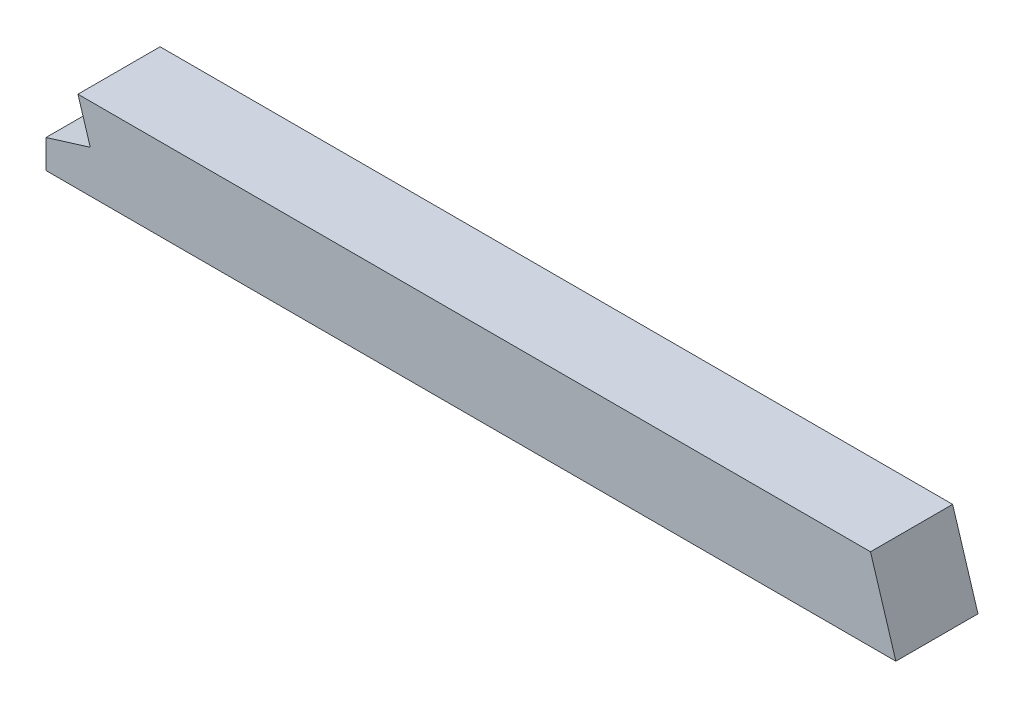
ISO-10303-21;
HEADER;
FILE_DESCRIPTION(('STEP AP214'),'2;1');
FILE_NAME('part.step','',(''),(''),'','','');
FILE_SCHEMA(('AUTOMOTIVE_DESIGN { 1 0 10303 214 1 1 1 1 }'));
ENDSEC;
DATA;
#1=APPLICATION_CONTEXT('core data for automotive mechanical design processes');
#2=APPLICATION_PROTOCOL_DEFINITION('international standard','automotive_design',2000,#1);
#3=PRODUCT_CONTEXT('',#1,'mechanical');
#4=PRODUCT('Part','Part','',(#3));
#5=PRODUCT_RELATED_PRODUCT_CATEGORY('part','',(#4));
#6=PRODUCT_DEFINITION_FORMATION('','',#4);
#7=PRODUCT_DEFINITION_CONTEXT('part definition',#1,'design');
#8=PRODUCT_DEFINITION('design','',#6,#7);
#9=PRODUCT_DEFINITION_SHAPE('','',#8);
#10=(LENGTH_UNIT() NAMED_UNIT(*) SI_UNIT(.MILLI.,.METRE.));
#11=(NAMED_UNIT(*) PLANE_ANGLE_UNIT() SI_UNIT($,.RADIAN.));
#12=(NAMED_UNIT(*) SI_UNIT($,.STERADIAN.) SOLID_ANGLE_UNIT());
#13=UNCERTAINTY_MEASURE_WITH_UNIT(LENGTH_MEASURE(1.E-05),#10,'distance_accuracy_value','');
#14=(GEOMETRIC_REPRESENTATION_CONTEXT(3) GLOBAL_UNCERTAINTY_ASSIGNED_CONTEXT((#13)) GLOBAL_UNIT_ASSIGNED_CONTEXT((#10,
#11,#12)) REPRESENTATION_CONTEXT('',''));
#15=CARTESIAN_POINT('',(0.,0.,0.));
#16=DIRECTION('',(0.,0.,1.));
#17=DIRECTION('',(1.,0.,0.));
#18=AXIS2_PLACEMENT_3D('',#15,#16,#17);
#19=CARTESIAN_POINT('',(394.2334,19.05,-19.05));
#20=DIRECTION('',(0.,0.,1.));
#21=DIRECTION('',(0.,-1.,0.));
#22=AXIS2_PLACEMENT_3D('',#19,#20,#21);
#23=PLANE('',#22);
#24=DIRECTION('',(0.,1.,0.));
#25=VECTOR('',#24,1.);
#26=CARTESIAN_POINT('',(0.,19.05,-19.05));
#27=LINE('',#26,#25);
#28=CARTESIAN_POINT('',(0.,-19.05,-19.05));
#29=VERTEX_POINT('',#28);
#30=CARTESIAN_POINT('',(0.,-5.7583149578052,-19.05));
#31=VERTEX_POINT('',#30);
#32=EDGE_CURVE('E122',#29,#31,#27,.T.);
#33=ORIENTED_EDGE('',*,*,#32,.T.);
#34=DIRECTION('',(0.955484572473958,0.295041067928275,0.));
#35=VECTOR('',#34,1.);
#36=CARTESIAN_POINT('',(1.62331038112594,-5.25705806447163,-19.05));
#37=LINE('',#36,#35);
#38=CARTESIAN_POINT('',(20.5222865781494,0.578697195797458,-19.05));
#39=VERTEX_POINT('',#38);
#40=EDGE_CURVE('E58',#31,#39,#37,.T.);
#41=ORIENTED_EDGE('',*,*,#40,.T.);
#42=DIRECTION('',(-0.295041067928275,0.955484572473958,0.));
#43=VECTOR('',#42,1.);
#44=CARTESIAN_POINT('',(18.8989761970235,5.83575526026909,-19.05));
#45=LINE('',#44,#43);
#46=CARTESIAN_POINT('',(14.8185912361433,19.05,-19.05));
#47=VERTEX_POINT('',#46);
#48=EDGE_CURVE('E109',#39,#47,#45,.T.);
#49=ORIENTED_EDGE('',*,*,#48,.T.);
#50=DIRECTION('',(-1.,0.,0.));
#51=VECTOR('',#50,1.);
#52=CARTESIAN_POINT('',(394.2334,19.05,-19.05));
#53=LINE('',#52,#51);
#54=CARTESIAN_POINT('',(382.468621151754,19.05,-19.05));
#55=VERTEX_POINT('',#54);
#56=EDGE_CURVE('E51',#55,#47,#53,.T.);
#57=ORIENTED_EDGE('',*,*,#56,.F.);
#58=DIRECTION('',(0.295041067928275,-0.955484572473958,0.));
#59=VECTOR('',#58,1.);
#60=CARTESIAN_POINT('',(394.2334,-19.05,-19.05));
#61=LINE('',#60,#59);
#62=CARTESIAN_POINT('',(394.2334,-19.05,-19.05));
#63=VERTEX_POINT('',#62);
#64=EDGE_CURVE('E135',#55,#63,#61,.T.);
#65=ORIENTED_EDGE('',*,*,#64,.T.);
#66=DIRECTION('',(-1.,0.,0.));
#67=VECTOR('',#66,1.);
#68=CARTESIAN_POINT('',(394.2334,-19.05,-19.05));
#69=LINE('',#68,#67);
#70=EDGE_CURVE('E145',#63,#29,#69,.T.);
#71=ORIENTED_EDGE('',*,*,#70,.T.);
#72=EDGE_LOOP('',(#33,#41,#49,#57,#65,#71));
#73=FACE_BOUND('',#72,.T.);
#74=ADVANCED_FACE('F43',(#73),#23,.F.);
#75=CARTESIAN_POINT('',(394.2334,19.05,19.05));
#76=DIRECTION('',(0.,-1.,0.));
#77=DIRECTION('',(0.,0.,-1.));
#78=AXIS2_PLACEMENT_3D('',#75,#76,#77);
#79=PLANE('',#78);
#80=ORIENTED_EDGE('',*,*,#56,.T.);
#81=DIRECTION('',(0.,0.,1.));
#82=VECTOR('',#81,1.);
#83=CARTESIAN_POINT('',(14.8185912361433,19.05,19.05));
#84=LINE('',#83,#82);
#85=CARTESIAN_POINT('',(14.8185912361433,19.05,19.05));
#86=VERTEX_POINT('',#85);
#87=EDGE_CURVE('E108',#47,#86,#84,.T.);
#88=ORIENTED_EDGE('',*,*,#87,.T.);
#89=DIRECTION('',(-1.,0.,0.));
#90=VECTOR('',#89,1.);
#91=CARTESIAN_POINT('',(394.2334,19.05,19.05));
#92=LINE('',#91,#90);
#93=CARTESIAN_POINT('',(382.468621151754,19.05,19.05));
#94=VERTEX_POINT('',#93);
#95=EDGE_CURVE('E158',#94,#86,#92,.T.);
#96=ORIENTED_EDGE('',*,*,#95,.F.);
#97=DIRECTION('',(0.,0.,1.));
#98=VECTOR('',#97,1.);
#99=CARTESIAN_POINT('',(382.468621151754,19.05,-19.05));
#100=LINE('',#99,#98);
#101=EDGE_CURVE('E138',#55,#94,#100,.T.);
#102=ORIENTED_EDGE('',*,*,#101,.F.);
#103=EDGE_LOOP('',(#80,#88,#96,#102));
#104=FACE_BOUND('',#103,.T.);
#105=ADVANCED_FACE('F166',(#104),#79,.F.);
#106=CARTESIAN_POINT('',(394.2334,19.05,19.05));
#107=DIRECTION('',(0.,0.,-1.));
#108=DIRECTION('',(0.,1.,0.));
#109=AXIS2_PLACEMENT_3D('',#106,#107,#108);
#110=PLANE('',#109);
#111=DIRECTION('',(-0.295041067928275,0.955484572473958,0.));
#112=VECTOR('',#111,1.);
#113=CARTESIAN_POINT('',(18.8989761970235,5.83575526026909,19.05));
#114=LINE('',#113,#112);
#115=CARTESIAN_POINT('',(20.5222865781494,0.578697195797458,19.05));
#116=VERTEX_POINT('',#115);
#117=EDGE_CURVE('E124',#116,#86,#114,.T.);
#118=ORIENTED_EDGE('',*,*,#117,.F.);
#119=DIRECTION('',(0.955484572473958,0.295041067928275,0.));
#120=VECTOR('',#119,1.);
#121=CARTESIAN_POINT('',(1.62331038112594,-5.25705806447163,19.05));
#122=LINE('',#121,#120);
#123=CARTESIAN_POINT('',(0.,-5.7583149578052,19.05));
#124=VERTEX_POINT('',#123);
#125=EDGE_CURVE('E104',#124,#116,#122,.T.);
#126=ORIENTED_EDGE('',*,*,#125,.F.);
#127=DIRECTION('',(0.,-1.,0.));
#128=VECTOR('',#127,1.);
#129=CARTESIAN_POINT('',(0.,19.05,19.05));
#130=LINE('',#129,#128);
#131=CARTESIAN_POINT('',(0.,-19.05,19.05));
#132=VERTEX_POINT('',#131);
#133=EDGE_CURVE('E79',#124,#132,#130,.T.);
#134=ORIENTED_EDGE('',*,*,#133,.T.);
#135=DIRECTION('',(-1.,0.,0.));
#136=VECTOR('',#135,1.);
#137=CARTESIAN_POINT('',(394.2334,-19.05,19.05));
#138=LINE('',#137,#136);
#139=CARTESIAN_POINT('',(394.2334,-19.05,19.05));
#140=VERTEX_POINT('',#139);
#141=EDGE_CURVE('E155',#140,#132,#138,.T.);
#142=ORIENTED_EDGE('',*,*,#141,.F.);
#143=DIRECTION('',(0.295041067928275,-0.955484572473958,0.));
#144=VECTOR('',#143,1.);
#145=CARTESIAN_POINT('',(394.2334,-19.05,19.05));
#146=LINE('',#145,#144);
#147=EDGE_CURVE('E66',#94,#140,#146,.T.);
#148=ORIENTED_EDGE('',*,*,#147,.F.);
#149=ORIENTED_EDGE('',*,*,#95,.T.);
#150=EDGE_LOOP('',(#118,#126,#134,#142,#148,#149));
#151=FACE_BOUND('',#150,.T.);
#152=ADVANCED_FACE('F174',(#151),#110,.F.);
#153=CARTESIAN_POINT('',(394.2334,-19.05,19.05));
#154=DIRECTION('',(0.,1.,0.));
#155=DIRECTION('',(0.,0.,1.));
#156=AXIS2_PLACEMENT_3D('',#153,#154,#155);
#157=PLANE('',#156);
#158=DIRECTION('',(0.,0.,-1.));
#159=VECTOR('',#158,1.);
#160=CARTESIAN_POINT('',(0.,-19.05,19.05));
#161=LINE('',#160,#159);
#162=EDGE_CURVE('E146',#132,#29,#161,.T.);
#163=ORIENTED_EDGE('',*,*,#162,.T.);
#164=ORIENTED_EDGE('',*,*,#70,.F.);
#165=DIRECTION('',(0.,0.,-1.));
#166=VECTOR('',#165,1.);
#167=CARTESIAN_POINT('',(394.2334,-19.05,19.05));
#168=LINE('',#167,#166);
#169=EDGE_CURVE('E84',#140,#63,#168,.T.);
#170=ORIENTED_EDGE('',*,*,#169,.F.);
#171=ORIENTED_EDGE('',*,*,#141,.T.);
#172=EDGE_LOOP('',(#163,#164,#170,#171));
#173=FACE_BOUND('',#172,.T.);
#174=ADVANCED_FACE('F170',(#173),#157,.F.);
#175=CARTESIAN_POINT('',(0.,0.,0.));
#176=DIRECTION('',(1.,0.,0.));
#177=DIRECTION('',(0.,0.,-1.));
#178=AXIS2_PLACEMENT_3D('',#175,#176,#177);
#179=PLANE('',#178);
#180=ORIENTED_EDGE('',*,*,#133,.F.);
#181=DIRECTION('',(0.,0.,-1.));
#182=VECTOR('',#181,1.);
#183=CARTESIAN_POINT('',(0.,-5.75831495780521,0.));
#184=LINE('',#183,#182);
#185=EDGE_CURVE('E11',#124,#31,#184,.T.);
#186=ORIENTED_EDGE('',*,*,#185,.T.);
#187=ORIENTED_EDGE('',*,*,#32,.F.);
#188=ORIENTED_EDGE('',*,*,#162,.F.);
#189=EDGE_LOOP('',(#180,#186,#187,#188));
#190=FACE_BOUND('',#189,.T.);
#191=ADVANCED_FACE('F173',(#190),#179,.F.);
#192=CARTESIAN_POINT('',(394.2334,-19.05,-19.05));
#193=DIRECTION('',(-0.955484572473958,-0.295041067928275,0.));
#194=DIRECTION('',(0.295041067928275,-0.955484572473958,0.));
#195=AXIS2_PLACEMENT_3D('',#192,#193,#194);
#196=PLANE('',#195);
#197=ORIENTED_EDGE('',*,*,#147,.T.);
#198=ORIENTED_EDGE('',*,*,#169,.T.);
#199=ORIENTED_EDGE('',*,*,#64,.F.);
#200=ORIENTED_EDGE('',*,*,#101,.T.);
#201=EDGE_LOOP('',(#197,#198,#199,#200));
#202=FACE_BOUND('',#201,.T.);
#203=ADVANCED_FACE('F175',(#202),#196,.F.);
#204=CARTESIAN_POINT('',(18.8989761970235,5.83575526026909,-19.05));
#205=DIRECTION('',(0.955484572473958,0.295041067928275,0.));
#206=DIRECTION('',(-0.295041067928275,0.955484572473958,0.));
#207=AXIS2_PLACEMENT_3D('',#204,#205,#206);
#208=PLANE('',#207);
#209=ORIENTED_EDGE('',*,*,#48,.F.);
#210=DIRECTION('',(0.,0.,1.));
#211=VECTOR('',#210,1.);
#212=CARTESIAN_POINT('',(20.5222865781494,0.578697195797458,-19.05));
#213=LINE('',#212,#211);
#214=EDGE_CURVE('E101',#39,#116,#213,.T.);
#215=ORIENTED_EDGE('',*,*,#214,.T.);
#216=ORIENTED_EDGE('',*,*,#117,.T.);
#217=ORIENTED_EDGE('',*,*,#87,.F.);
#218=EDGE_LOOP('',(#209,#215,#216,#217));
#219=FACE_BOUND('',#218,.T.);
#220=ADVANCED_FACE('F112',(#219),#208,.F.);
#221=CARTESIAN_POINT('',(1.62331038112594,-5.25705806447163,-19.05));
#222=DIRECTION('',(0.295041067928275,-0.955484572473958,0.));
#223=DIRECTION('',(0.955484572473958,0.295041067928275,0.));
#224=AXIS2_PLACEMENT_3D('',#221,#222,#223);
#225=PLANE('',#224);
#226=ORIENTED_EDGE('',*,*,#125,.T.);
#227=ORIENTED_EDGE('',*,*,#214,.F.);
#228=ORIENTED_EDGE('',*,*,#40,.F.);
#229=ORIENTED_EDGE('',*,*,#185,.F.);
#230=EDGE_LOOP('',(#226,#227,#228,#229));
#231=FACE_BOUND('',#230,.T.);
#232=ADVANCED_FACE('F103',(#231),#225,.F.);
#233=CLOSED_SHELL('',(#74,#105,#152,#174,#191,#203,#220,#232));
#234=MANIFOLD_SOLID_BREP('B2',#233);
#235=ADVANCED_BREP_SHAPE_REPRESENTATION('',(#18,#234),#14);
#236=SHAPE_DEFINITION_REPRESENTATION(#9,#235);
ENDSEC;
END-ISO-10303-21;
